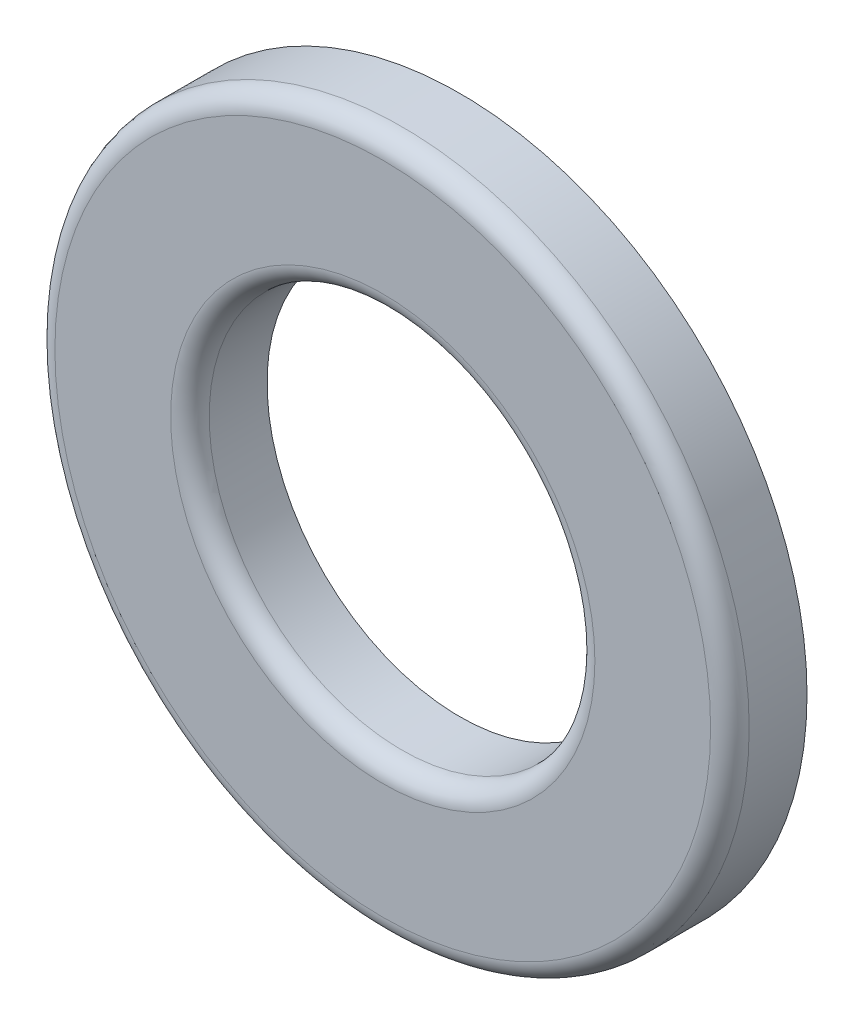
ISO-10303-21;
HEADER;
FILE_DESCRIPTION(('STEP AP214'),'2;1');
FILE_NAME('part.step','',(''),(''),'','','');
FILE_SCHEMA(('AUTOMOTIVE_DESIGN { 1 0 10303 214 1 1 1 1 }'));
ENDSEC;
DATA;
#1=APPLICATION_CONTEXT('core data for automotive mechanical design processes');
#2=APPLICATION_PROTOCOL_DEFINITION('international standard','automotive_design',2000,#1);
#3=PRODUCT_CONTEXT('',#1,'mechanical');
#4=PRODUCT('Part','Part','',(#3));
#5=PRODUCT_RELATED_PRODUCT_CATEGORY('part','',(#4));
#6=PRODUCT_DEFINITION_FORMATION('','',#4);
#7=PRODUCT_DEFINITION_CONTEXT('part definition',#1,'design');
#8=PRODUCT_DEFINITION('design','',#6,#7);
#9=PRODUCT_DEFINITION_SHAPE('','',#8);
#10=(LENGTH_UNIT() NAMED_UNIT(*) SI_UNIT(.MILLI.,.METRE.));
#11=(NAMED_UNIT(*) PLANE_ANGLE_UNIT() SI_UNIT($,.RADIAN.));
#12=(NAMED_UNIT(*) SI_UNIT($,.STERADIAN.) SOLID_ANGLE_UNIT());
#13=UNCERTAINTY_MEASURE_WITH_UNIT(LENGTH_MEASURE(1.E-05),#10,'distance_accuracy_value','');
#14=(GEOMETRIC_REPRESENTATION_CONTEXT(3) GLOBAL_UNCERTAINTY_ASSIGNED_CONTEXT((#13)) GLOBAL_UNIT_ASSIGNED_CONTEXT((#10,
#11,#12)) REPRESENTATION_CONTEXT('',''));
#15=CARTESIAN_POINT('',(0.,0.,0.));
#16=DIRECTION('',(0.,0.,1.));
#17=DIRECTION('',(1.,0.,0.));
#18=AXIS2_PLACEMENT_3D('',#15,#16,#17);
#19=CARTESIAN_POINT('',(0.,0.,1.));
#20=DIRECTION('',(0.,0.,1.));
#21=DIRECTION('',(1.,0.,0.));
#22=AXIS2_PLACEMENT_3D('',#19,#20,#21);
#23=PLANE('',#22);
#24=CARTESIAN_POINT('',(0.,0.,1.));
#25=DIRECTION('',(0.,0.,1.));
#26=DIRECTION('',(1.,0.,0.));
#27=AXIS2_PLACEMENT_3D('',#24,#25,#26);
#28=CIRCLE('',#27,2.75);
#29=CARTESIAN_POINT('',(2.75,0.,1.));
#30=VERTEX_POINT('',#29);
#31=EDGE_CURVE('E38',#30,#30,#28,.F.);
#32=ORIENTED_EDGE('',*,*,#31,.T.);
#33=EDGE_LOOP('',(#32));
#34=FACE_BOUND('',#33,.T.);
#35=CARTESIAN_POINT('',(0.,0.,1.));
#36=DIRECTION('',(0.,0.,1.));
#37=DIRECTION('',(1.,0.,0.));
#38=AXIS2_PLACEMENT_3D('',#35,#36,#37);
#39=CIRCLE('',#38,4.25);
#40=CARTESIAN_POINT('',(4.25,0.,1.));
#41=VERTEX_POINT('',#40);
#42=EDGE_CURVE('E42',#41,#41,#39,.T.);
#43=ORIENTED_EDGE('',*,*,#42,.T.);
#44=EDGE_LOOP('',(#43));
#45=FACE_BOUND('',#44,.T.);
#46=ADVANCED_FACE('F31',(#34,#45),#23,.T.);
#47=CARTESIAN_POINT('',(0.,0.,0.));
#48=DIRECTION('',(0.,0.,1.));
#49=DIRECTION('',(1.,0.,0.));
#50=AXIS2_PLACEMENT_3D('',#47,#48,#49);
#51=PLANE('',#50);
#52=CARTESIAN_POINT('',(0.,0.,0.));
#53=DIRECTION('',(0.,0.,1.));
#54=DIRECTION('',(1.,0.,0.));
#55=AXIS2_PLACEMENT_3D('',#52,#53,#54);
#56=CIRCLE('',#55,4.5);
#57=CARTESIAN_POINT('',(4.5,0.,0.));
#58=VERTEX_POINT('',#57);
#59=EDGE_CURVE('E51',#58,#58,#56,.T.);
#60=ORIENTED_EDGE('',*,*,#59,.F.);
#61=EDGE_LOOP('',(#60));
#62=FACE_BOUND('',#61,.T.);
#63=CARTESIAN_POINT('',(0.,0.,0.));
#64=DIRECTION('',(0.,0.,1.));
#65=DIRECTION('',(1.,0.,0.));
#66=AXIS2_PLACEMENT_3D('',#63,#64,#65);
#67=CIRCLE('',#66,2.5);
#68=CARTESIAN_POINT('',(2.5,0.,0.));
#69=VERTEX_POINT('',#68);
#70=EDGE_CURVE('E54',#69,#69,#67,.T.);
#71=ORIENTED_EDGE('',*,*,#70,.T.);
#72=EDGE_LOOP('',(#71));
#73=FACE_BOUND('',#72,.T.);
#74=ADVANCED_FACE('F58',(#62,#73),#51,.F.);
#75=CARTESIAN_POINT('',(0.,0.,1.));
#76=DIRECTION('',(0.,0.,-1.));
#77=DIRECTION('',(-1.,0.,0.));
#78=AXIS2_PLACEMENT_3D('',#75,#76,#77);
#79=CYLINDRICAL_SURFACE('',#78,4.5);
#80=CARTESIAN_POINT('',(0.,0.,0.75));
#81=DIRECTION('',(0.,0.,1.));
#82=DIRECTION('',(1.,0.,0.));
#83=AXIS2_PLACEMENT_3D('',#80,#81,#82);
#84=CIRCLE('',#83,4.5);
#85=CARTESIAN_POINT('',(4.5,0.,0.75));
#86=VERTEX_POINT('',#85);
#87=EDGE_CURVE('E10',#86,#86,#84,.F.);
#88=ORIENTED_EDGE('',*,*,#87,.T.);
#89=EDGE_LOOP('',(#88));
#90=FACE_BOUND('',#89,.T.);
#91=ORIENTED_EDGE('',*,*,#59,.T.);
#92=EDGE_LOOP('',(#91));
#93=FACE_BOUND('',#92,.T.);
#94=ADVANCED_FACE('F63',(#90,#93),#79,.T.);
#95=CARTESIAN_POINT('',(0.,0.,1.));
#96=DIRECTION('',(0.,0.,-1.));
#97=DIRECTION('',(-1.,0.,0.));
#98=AXIS2_PLACEMENT_3D('',#95,#96,#97);
#99=CYLINDRICAL_SURFACE('',#98,2.5);
#100=CARTESIAN_POINT('',(0.,0.,0.75));
#101=DIRECTION('',(0.,0.,1.));
#102=DIRECTION('',(1.,0.,0.));
#103=AXIS2_PLACEMENT_3D('',#100,#101,#102);
#104=CIRCLE('',#103,2.5);
#105=CARTESIAN_POINT('',(2.5,0.,0.75));
#106=VERTEX_POINT('',#105);
#107=EDGE_CURVE('E46',#106,#106,#104,.T.);
#108=ORIENTED_EDGE('',*,*,#107,.T.);
#109=EDGE_LOOP('',(#108));
#110=FACE_BOUND('',#109,.T.);
#111=ORIENTED_EDGE('',*,*,#70,.F.);
#112=EDGE_LOOP('',(#111));
#113=FACE_BOUND('',#112,.T.);
#114=ADVANCED_FACE('F60',(#110,#113),#99,.F.);
#115=CARTESIAN_POINT('',(0.,0.,0.75));
#116=DIRECTION('',(0.,0.,1.));
#117=DIRECTION('',(1.,0.,0.));
#118=AXIS2_PLACEMENT_3D('',#115,#116,#117);
#119=TOROIDAL_SURFACE('',#118,2.75,0.25);
#120=ORIENTED_EDGE('',*,*,#31,.F.);
#121=EDGE_LOOP('',(#120));
#122=FACE_BOUND('',#121,.T.);
#123=ORIENTED_EDGE('',*,*,#107,.F.);
#124=EDGE_LOOP('',(#123));
#125=FACE_BOUND('',#124,.T.);
#126=ADVANCED_FACE('F62',(#122,#125),#119,.T.);
#127=CARTESIAN_POINT('',(0.,0.,0.75));
#128=DIRECTION('',(0.,0.,1.));
#129=DIRECTION('',(1.,0.,0.));
#130=AXIS2_PLACEMENT_3D('',#127,#128,#129);
#131=TOROIDAL_SURFACE('',#130,4.25,0.25);
#132=ORIENTED_EDGE('',*,*,#87,.F.);
#133=EDGE_LOOP('',(#132));
#134=FACE_BOUND('',#133,.T.);
#135=ORIENTED_EDGE('',*,*,#42,.F.);
#136=EDGE_LOOP('',(#135));
#137=FACE_BOUND('',#136,.T.);
#138=ADVANCED_FACE('F33',(#134,#137),#131,.T.);
#139=CLOSED_SHELL('',(#46,#74,#94,#114,#126,#138));
#140=MANIFOLD_SOLID_BREP('B2',#139);
#141=ADVANCED_BREP_SHAPE_REPRESENTATION('',(#18,#140),#14);
#142=SHAPE_DEFINITION_REPRESENTATION(#9,#141);
ENDSEC;
END-ISO-10303-21;
